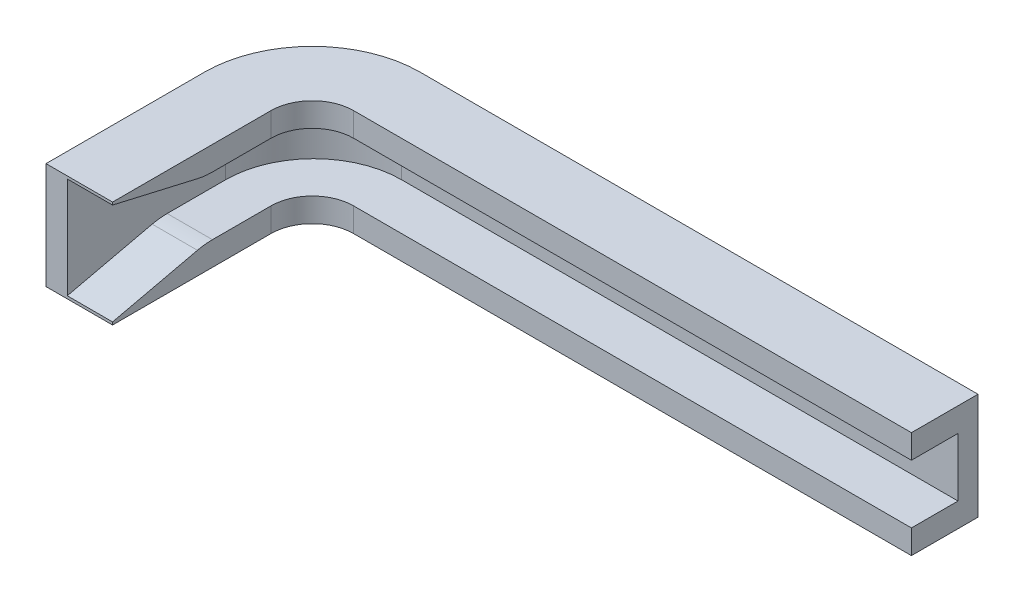
ISO-10303-21;
HEADER;
FILE_DESCRIPTION(('STEP AP214'),'2;1');
FILE_NAME('part.step','',(''),(''),'','','');
FILE_SCHEMA(('AUTOMOTIVE_DESIGN { 1 0 10303 214 1 1 1 1 }'));
ENDSEC;
DATA;
#1=APPLICATION_CONTEXT('core data for automotive mechanical design processes');
#2=APPLICATION_PROTOCOL_DEFINITION('international standard','automotive_design',2000,#1);
#3=PRODUCT_CONTEXT('',#1,'mechanical');
#4=PRODUCT('Part','Part','',(#3));
#5=PRODUCT_RELATED_PRODUCT_CATEGORY('part','',(#4));
#6=PRODUCT_DEFINITION_FORMATION('','',#4);
#7=PRODUCT_DEFINITION_CONTEXT('part definition',#1,'design');
#8=PRODUCT_DEFINITION('design','',#6,#7);
#9=PRODUCT_DEFINITION_SHAPE('','',#8);
#10=(LENGTH_UNIT() NAMED_UNIT(*) SI_UNIT(.MILLI.,.METRE.));
#11=(NAMED_UNIT(*) PLANE_ANGLE_UNIT() SI_UNIT($,.RADIAN.));
#12=(NAMED_UNIT(*) SI_UNIT($,.STERADIAN.) SOLID_ANGLE_UNIT());
#13=UNCERTAINTY_MEASURE_WITH_UNIT(LENGTH_MEASURE(1.E-05),#10,'distance_accuracy_value','');
#14=(GEOMETRIC_REPRESENTATION_CONTEXT(3) GLOBAL_UNCERTAINTY_ASSIGNED_CONTEXT((#13)) GLOBAL_UNIT_ASSIGNED_CONTEXT((#10,
#11,#12)) REPRESENTATION_CONTEXT('',''));
#15=CARTESIAN_POINT('',(0.,0.,0.));
#16=DIRECTION('',(0.,0.,1.));
#17=DIRECTION('',(1.,0.,0.));
#18=AXIS2_PLACEMENT_3D('',#15,#16,#17);
#19=CARTESIAN_POINT('',(0.,0.,20.));
#20=DIRECTION('',(1.,0.,0.));
#21=DIRECTION('',(0.,0.,-1.));
#22=AXIS2_PLACEMENT_3D('',#19,#20,#21);
#23=PLANE('',#22);
#24=DIRECTION('',(0.,0.,-1.));
#25=VECTOR('',#24,1.);
#26=CARTESIAN_POINT('',(0.,7.99999999999999,20.));
#27=LINE('',#26,#25);
#28=CARTESIAN_POINT('',(0.,7.99999999999999,20.));
#29=VERTEX_POINT('',#28);
#30=CARTESIAN_POINT('',(0.,7.99999999999999,8.1));
#31=VERTEX_POINT('',#30);
#32=EDGE_CURVE('E203',#29,#31,#27,.T.);
#33=ORIENTED_EDGE('',*,*,#32,.T.);
#34=DIRECTION('',(0.,-1.,0.));
#35=VECTOR('',#34,1.);
#36=CARTESIAN_POINT('',(0.,0.,8.1));
#37=LINE('',#36,#35);
#38=CARTESIAN_POINT('',(0.,0.,8.1));
#39=VERTEX_POINT('',#38);
#40=EDGE_CURVE('E219',#31,#39,#37,.T.);
#41=ORIENTED_EDGE('',*,*,#40,.T.);
#42=DIRECTION('',(0.,0.,-1.));
#43=VECTOR('',#42,1.);
#44=CARTESIAN_POINT('',(0.,0.,20.));
#45=LINE('',#44,#43);
#46=CARTESIAN_POINT('',(0.,0.,20.));
#47=VERTEX_POINT('',#46);
#48=EDGE_CURVE('E198',#47,#39,#45,.T.);
#49=ORIENTED_EDGE('',*,*,#48,.F.);
#50=DIRECTION('',(0.,-1.,0.));
#51=VECTOR('',#50,1.);
#52=CARTESIAN_POINT('',(0.,0.,20.));
#53=LINE('',#52,#51);
#54=EDGE_CURVE('E336',#29,#47,#53,.T.);
#55=ORIENTED_EDGE('',*,*,#54,.F.);
#56=EDGE_LOOP('',(#33,#41,#49,#55));
#57=FACE_BOUND('',#56,.T.);
#58=ADVANCED_FACE('F33',(#57),#23,.F.);
#59=CARTESIAN_POINT('',(0.,0.,20.));
#60=DIRECTION('',(0.,1.,0.));
#61=DIRECTION('',(0.,0.,1.));
#62=AXIS2_PLACEMENT_3D('',#59,#60,#61);
#63=PLANE('',#62);
#64=ORIENTED_EDGE('',*,*,#48,.T.);
#65=CARTESIAN_POINT('',(8.1,0.,8.1));
#66=DIRECTION('',(0.,1.,0.));
#67=DIRECTION('',(0.,0.,1.));
#68=AXIS2_PLACEMENT_3D('',#65,#66,#67);
#69=CIRCLE('',#68,8.1);
#70=CARTESIAN_POINT('',(8.1,0.,0.));
#71=VERTEX_POINT('',#70);
#72=EDGE_CURVE('E222',#39,#71,#69,.F.);
#73=ORIENTED_EDGE('',*,*,#72,.T.);
#74=DIRECTION('',(1.,0.,0.));
#75=VECTOR('',#74,1.);
#76=CARTESIAN_POINT('',(0.,0.,0.));
#77=LINE('',#76,#75);
#78=CARTESIAN_POINT('',(50.,0.,0.));
#79=VERTEX_POINT('',#78);
#80=EDGE_CURVE('E197',#71,#79,#77,.T.);
#81=ORIENTED_EDGE('',*,*,#80,.T.);
#82=DIRECTION('',(0.,0.,-1.));
#83=VECTOR('',#82,1.);
#84=CARTESIAN_POINT('',(50.,0.,20.));
#85=LINE('',#84,#83);
#86=CARTESIAN_POINT('',(50.,0.,5.00000000000001));
#87=VERTEX_POINT('',#86);
#88=EDGE_CURVE('E187',#87,#79,#85,.T.);
#89=ORIENTED_EDGE('',*,*,#88,.F.);
#90=DIRECTION('',(1.,0.,0.));
#91=VECTOR('',#90,1.);
#92=CARTESIAN_POINT('',(5.,0.,5.));
#93=LINE('',#92,#91);
#94=CARTESIAN_POINT('',(8.1,0.,5.));
#95=VERTEX_POINT('',#94);
#96=EDGE_CURVE('E170',#95,#87,#93,.T.);
#97=ORIENTED_EDGE('',*,*,#96,.F.);
#98=CARTESIAN_POINT('',(8.1,0.,8.1));
#99=DIRECTION('',(0.,1.,0.));
#100=DIRECTION('',(0.,0.,1.));
#101=AXIS2_PLACEMENT_3D('',#98,#99,#100);
#102=CIRCLE('',#101,3.1);
#103=CARTESIAN_POINT('',(5.,0.,8.1));
#104=VERTEX_POINT('',#103);
#105=EDGE_CURVE('E237',#95,#104,#102,.T.);
#106=ORIENTED_EDGE('',*,*,#105,.T.);
#107=DIRECTION('',(0.,0.,-1.));
#108=VECTOR('',#107,1.);
#109=CARTESIAN_POINT('',(5.,0.,20.));
#110=LINE('',#109,#108);
#111=CARTESIAN_POINT('',(5.,0.,20.));
#112=VERTEX_POINT('',#111);
#113=EDGE_CURVE('E180',#112,#104,#110,.T.);
#114=ORIENTED_EDGE('',*,*,#113,.F.);
#115=DIRECTION('',(1.,0.,0.));
#116=VECTOR('',#115,1.);
#117=CARTESIAN_POINT('',(0.,0.,20.));
#118=LINE('',#117,#116);
#119=EDGE_CURVE('E303',#47,#112,#118,.T.);
#120=ORIENTED_EDGE('',*,*,#119,.F.);
#121=EDGE_LOOP('',(#64,#73,#81,#89,#97,#106,#114,#120));
#122=FACE_BOUND('',#121,.T.);
#123=ADVANCED_FACE('F195',(#122),#63,.F.);
#124=CARTESIAN_POINT('',(50.,0.,20.));
#125=DIRECTION('',(-1.,0.,0.));
#126=DIRECTION('',(0.,0.,1.));
#127=AXIS2_PLACEMENT_3D('',#124,#125,#126);
#128=PLANE('',#127);
#129=DIRECTION('',(0.,0.,-1.));
#130=VECTOR('',#129,1.);
#131=CARTESIAN_POINT('',(50.,7.99999999999999,20.));
#132=LINE('',#131,#130);
#133=CARTESIAN_POINT('',(50.,7.99999999999999,5.00000000000001));
#134=VERTEX_POINT('',#133);
#135=CARTESIAN_POINT('',(50.,7.99999999999999,0.));
#136=VERTEX_POINT('',#135);
#137=EDGE_CURVE('E199',#134,#136,#132,.T.);
#138=ORIENTED_EDGE('',*,*,#137,.F.);
#139=DIRECTION('',(0.,-1.,0.));
#140=VECTOR('',#139,1.);
#141=CARTESIAN_POINT('',(50.,18.,5.00000000000001));
#142=LINE('',#141,#140);
#143=CARTESIAN_POINT('',(50.,6.20366363266101,5.00000000000001));
#144=VERTEX_POINT('',#143);
#145=EDGE_CURVE('E192',#134,#144,#142,.T.);
#146=ORIENTED_EDGE('',*,*,#145,.T.);
#147=DIRECTION('',(0.,0.,1.));
#148=VECTOR('',#147,1.);
#149=CARTESIAN_POINT('',(50.,6.20366363266101,1.5));
#150=LINE('',#149,#148);
#151=CARTESIAN_POINT('',(50.,6.20366363266101,1.5));
#152=VERTEX_POINT('',#151);
#153=EDGE_CURVE('E332',#152,#144,#150,.T.);
#154=ORIENTED_EDGE('',*,*,#153,.F.);
#155=DIRECTION('',(0.,1.,0.));
#156=VECTOR('',#155,1.);
#157=CARTESIAN_POINT('',(50.,6.20366363266101,1.5));
#158=LINE('',#157,#156);
#159=CARTESIAN_POINT('',(50.,1.803663632661,1.5));
#160=VERTEX_POINT('',#159);
#161=EDGE_CURVE('E325',#160,#152,#158,.T.);
#162=ORIENTED_EDGE('',*,*,#161,.F.);
#163=DIRECTION('',(0.,0.,1.));
#164=VECTOR('',#163,1.);
#165=CARTESIAN_POINT('',(50.,1.803663632661,1.5));
#166=LINE('',#165,#164);
#167=CARTESIAN_POINT('',(50.,1.803663632661,5.));
#168=VERTEX_POINT('',#167);
#169=EDGE_CURVE('E191',#160,#168,#166,.T.);
#170=ORIENTED_EDGE('',*,*,#169,.T.);
#171=EDGE_CURVE('E174',#168,#87,#142,.T.);
#172=ORIENTED_EDGE('',*,*,#171,.T.);
#173=ORIENTED_EDGE('',*,*,#88,.T.);
#174=DIRECTION('',(0.,1.,0.));
#175=VECTOR('',#174,1.);
#176=CARTESIAN_POINT('',(50.,0.,0.));
#177=LINE('',#176,#175);
#178=EDGE_CURVE('E343',#79,#136,#177,.T.);
#179=ORIENTED_EDGE('',*,*,#178,.T.);
#180=EDGE_LOOP('',(#138,#146,#154,#162,#170,#172,#173,#179));
#181=FACE_BOUND('',#180,.T.);
#182=ADVANCED_FACE('F185',(#181),#128,.F.);
#183=CARTESIAN_POINT('',(0.,7.99999999999999,20.));
#184=DIRECTION('',(0.,-1.,0.));
#185=DIRECTION('',(0.,0.,-1.));
#186=AXIS2_PLACEMENT_3D('',#183,#184,#185);
#187=PLANE('',#186);
#188=DIRECTION('',(-1.,0.,0.));
#189=VECTOR('',#188,1.);
#190=CARTESIAN_POINT('',(0.,7.99999999999999,0.));
#191=LINE('',#190,#189);
#192=CARTESIAN_POINT('',(8.1,7.99999999999999,0.));
#193=VERTEX_POINT('',#192);
#194=EDGE_CURVE('E338',#136,#193,#191,.T.);
#195=ORIENTED_EDGE('',*,*,#194,.T.);
#196=CARTESIAN_POINT('',(8.1,7.99999999999999,8.1));
#197=DIRECTION('',(0.,-1.,0.));
#198=DIRECTION('',(0.,0.,-1.));
#199=AXIS2_PLACEMENT_3D('',#196,#197,#198);
#200=CIRCLE('',#199,8.1);
#201=EDGE_CURVE('E226',#193,#31,#200,.F.);
#202=ORIENTED_EDGE('',*,*,#201,.T.);
#203=ORIENTED_EDGE('',*,*,#32,.F.);
#204=DIRECTION('',(-1.,0.,0.));
#205=VECTOR('',#204,1.);
#206=CARTESIAN_POINT('',(0.,7.99999999999999,20.));
#207=LINE('',#206,#205);
#208=CARTESIAN_POINT('',(5.,7.99999999999999,20.));
#209=VERTEX_POINT('',#208);
#210=EDGE_CURVE('E340',#209,#29,#207,.T.);
#211=ORIENTED_EDGE('',*,*,#210,.F.);
#212=DIRECTION('',(0.,0.,-1.));
#213=VECTOR('',#212,1.);
#214=CARTESIAN_POINT('',(5.,7.99999999999999,20.));
#215=LINE('',#214,#213);
#216=CARTESIAN_POINT('',(5.,7.99999999999999,8.1));
#217=VERTEX_POINT('',#216);
#218=EDGE_CURVE('E320',#209,#217,#215,.T.);
#219=ORIENTED_EDGE('',*,*,#218,.T.);
#220=CARTESIAN_POINT('',(8.1,7.99999999999999,8.1));
#221=DIRECTION('',(0.,-1.,0.));
#222=DIRECTION('',(0.,0.,-1.));
#223=AXIS2_PLACEMENT_3D('',#220,#221,#222);
#224=CIRCLE('',#223,3.1);
#225=CARTESIAN_POINT('',(8.1,7.99999999999999,5.));
#226=VERTEX_POINT('',#225);
#227=EDGE_CURVE('E243',#217,#226,#224,.T.);
#228=ORIENTED_EDGE('',*,*,#227,.T.);
#229=DIRECTION('',(1.,0.,0.));
#230=VECTOR('',#229,1.);
#231=CARTESIAN_POINT('',(0.,7.99999999999999,5.));
#232=LINE('',#231,#230);
#233=EDGE_CURVE('E315',#226,#134,#232,.T.);
#234=ORIENTED_EDGE('',*,*,#233,.T.);
#235=ORIENTED_EDGE('',*,*,#137,.T.);
#236=EDGE_LOOP('',(#195,#202,#203,#211,#219,#228,#234,#235));
#237=FACE_BOUND('',#236,.T.);
#238=ADVANCED_FACE('F363',(#237),#187,.F.);
#239=CARTESIAN_POINT('',(0.,0.,20.));
#240=DIRECTION('',(0.,0.,-1.));
#241=DIRECTION('',(-1.,0.,0.));
#242=AXIS2_PLACEMENT_3D('',#239,#240,#241);
#243=PLANE('',#242);
#244=DIRECTION('',(0.,-1.,0.));
#245=VECTOR('',#244,1.);
#246=CARTESIAN_POINT('',(5.,18.,20.));
#247=LINE('',#246,#245);
#248=CARTESIAN_POINT('',(5.,0.203663632661003,20.));
#249=VERTEX_POINT('',#248);
#250=EDGE_CURVE('E301',#249,#112,#247,.T.);
#251=ORIENTED_EDGE('',*,*,#250,.F.);
#252=DIRECTION('',(-1.,0.,0.));
#253=VECTOR('',#252,1.);
#254=CARTESIAN_POINT('',(0.,0.203663632661004,20.));
#255=LINE('',#254,#253);
#256=CARTESIAN_POINT('',(1.6,0.203663632661004,20.));
#257=VERTEX_POINT('',#256);
#258=EDGE_CURVE('E249',#249,#257,#255,.T.);
#259=ORIENTED_EDGE('',*,*,#258,.T.);
#260=DIRECTION('',(0.,-1.,0.));
#261=VECTOR('',#260,1.);
#262=CARTESIAN_POINT('',(1.6,6.20366363266101,20.));
#263=LINE('',#262,#261);
#264=CARTESIAN_POINT('',(1.6,7.80366363266101,20.));
#265=VERTEX_POINT('',#264);
#266=EDGE_CURVE('E298',#265,#257,#263,.T.);
#267=ORIENTED_EDGE('',*,*,#266,.F.);
#268=DIRECTION('',(1.,0.,0.));
#269=VECTOR('',#268,1.);
#270=CARTESIAN_POINT('',(0.,7.80366363266101,20.));
#271=LINE('',#270,#269);
#272=CARTESIAN_POINT('',(5.,7.80366363266101,20.));
#273=VERTEX_POINT('',#272);
#274=EDGE_CURVE('E247',#265,#273,#271,.T.);
#275=ORIENTED_EDGE('',*,*,#274,.T.);
#276=EDGE_CURVE('E306',#209,#273,#247,.T.);
#277=ORIENTED_EDGE('',*,*,#276,.F.);
#278=ORIENTED_EDGE('',*,*,#210,.T.);
#279=ORIENTED_EDGE('',*,*,#54,.T.);
#280=ORIENTED_EDGE('',*,*,#119,.T.);
#281=EDGE_LOOP('',(#251,#259,#267,#275,#277,#278,#279,#280));
#282=FACE_BOUND('',#281,.T.);
#283=ADVANCED_FACE('F297',(#282),#243,.F.);
#284=CARTESIAN_POINT('',(0.,0.,0.));
#285=DIRECTION('',(0.,0.,-1.));
#286=DIRECTION('',(-1.,0.,0.));
#287=AXIS2_PLACEMENT_3D('',#284,#285,#286);
#288=PLANE('',#287);
#289=ORIENTED_EDGE('',*,*,#80,.F.);
#290=DIRECTION('',(0.,-1.,0.));
#291=VECTOR('',#290,1.);
#292=CARTESIAN_POINT('',(8.1,7.99999999999999,0.));
#293=LINE('',#292,#291);
#294=EDGE_CURVE('E224',#71,#193,#293,.F.);
#295=ORIENTED_EDGE('',*,*,#294,.T.);
#296=ORIENTED_EDGE('',*,*,#194,.F.);
#297=ORIENTED_EDGE('',*,*,#178,.F.);
#298=EDGE_LOOP('',(#289,#295,#296,#297));
#299=FACE_BOUND('',#298,.T.);
#300=ADVANCED_FACE('F359',(#299),#288,.T.);
#301=CARTESIAN_POINT('',(1.6,6.20366363266101,1.5));
#302=DIRECTION('',(-1.,0.,0.));
#303=DIRECTION('',(0.,-1.,0.));
#304=AXIS2_PLACEMENT_3D('',#301,#302,#303);
#305=PLANE('',#304);
#306=DIRECTION('',(0.,0.,1.));
#307=VECTOR('',#306,1.);
#308=CARTESIAN_POINT('',(1.6,1.803663632661,1.5));
#309=LINE('',#308,#307);
#310=CARTESIAN_POINT('',(1.6,1.803663632661,8.1));
#311=VERTEX_POINT('',#310);
#312=CARTESIAN_POINT('',(1.6,1.803663632661,12.4999605596372));
#313=VERTEX_POINT('',#312);
#314=EDGE_CURVE('E275',#311,#313,#309,.T.);
#315=ORIENTED_EDGE('',*,*,#314,.F.);
#316=DIRECTION('',(0.,-1.,0.));
#317=VECTOR('',#316,1.);
#318=CARTESIAN_POINT('',(1.6,6.20366363266101,8.1));
#319=LINE('',#318,#317);
#320=CARTESIAN_POINT('',(1.6,6.20366363266101,8.1));
#321=VERTEX_POINT('',#320);
#322=EDGE_CURVE('E215',#311,#321,#319,.F.);
#323=ORIENTED_EDGE('',*,*,#322,.T.);
#324=DIRECTION('',(0.,0.,1.));
#325=VECTOR('',#324,1.);
#326=CARTESIAN_POINT('',(1.6,6.20366363266101,1.5));
#327=LINE('',#326,#325);
#328=CARTESIAN_POINT('',(1.6,6.20366363266101,12.4999605596372));
#329=VERTEX_POINT('',#328);
#330=EDGE_CURVE('E330',#321,#329,#327,.T.);
#331=ORIENTED_EDGE('',*,*,#330,.T.);
#332=CARTESIAN_POINT('',(1.6,11.203663632661,12.4999605596372));
#333=DIRECTION('',(-1.,0.,0.));
#334=DIRECTION('',(0.,-1.,0.));
#335=AXIS2_PLACEMENT_3D('',#332,#333,#334);
#336=CIRCLE('',#335,5.);
#337=CARTESIAN_POINT('',(1.6,6.33181330873483,13.6247158313565));
#338=VERTEX_POINT('',#337);
#339=EDGE_CURVE('E11',#329,#338,#336,.T.);
#340=ORIENTED_EDGE('',*,*,#339,.T.);
#341=DIRECTION('',(0.,-0.224951054343867,-0.974370064785235));
#342=VECTOR('',#341,1.);
#343=CARTESIAN_POINT('',(1.6,3.66776576190135,2.08545815430146));
#344=LINE('',#343,#342);
#345=EDGE_CURVE('E257',#338,#265,#344,.F.);
#346=ORIENTED_EDGE('',*,*,#345,.T.);
#347=ORIENTED_EDGE('',*,*,#266,.T.);
#348=DIRECTION('',(0.,-0.224951054343867,0.974370064785235));
#349=VECTOR('',#348,1.);
#350=CARTESIAN_POINT('',(1.6,4.56221460156251,1.12104163136548));
#351=LINE('',#350,#349);
#352=CARTESIAN_POINT('',(1.6,1.67551395658718,13.6247158313565));
#353=VERTEX_POINT('',#352);
#354=EDGE_CURVE('E254',#257,#353,#351,.F.);
#355=ORIENTED_EDGE('',*,*,#354,.T.);
#356=CARTESIAN_POINT('',(1.6,-3.196336367339,12.4999605596372));
#357=DIRECTION('',(-1.,0.,0.));
#358=DIRECTION('',(0.,-1.,0.));
#359=AXIS2_PLACEMENT_3D('',#356,#357,#358);
#360=CIRCLE('',#359,5.);
#361=EDGE_CURVE('E41',#353,#313,#360,.T.);
#362=ORIENTED_EDGE('',*,*,#361,.T.);
#363=EDGE_LOOP('',(#315,#323,#331,#340,#346,#347,#355,#362));
#364=FACE_BOUND('',#363,.T.);
#365=ADVANCED_FACE('F274',(#364),#305,.F.);
#366=CARTESIAN_POINT('',(1.6,6.20366363266101,1.5));
#367=DIRECTION('',(0.,1.,0.));
#368=DIRECTION('',(0.,0.,1.));
#369=AXIS2_PLACEMENT_3D('',#366,#367,#368);
#370=PLANE('',#369);
#371=DIRECTION('',(0.,0.,1.));
#372=VECTOR('',#371,1.);
#373=CARTESIAN_POINT('',(5.,6.20366363266101,1.5));
#374=LINE('',#373,#372);
#375=CARTESIAN_POINT('',(5.,6.20366363266101,8.1));
#376=VERTEX_POINT('',#375);
#377=CARTESIAN_POINT('',(5.,6.20366363266101,12.4999605596372));
#378=VERTEX_POINT('',#377);
#379=EDGE_CURVE('E317',#376,#378,#374,.T.);
#380=ORIENTED_EDGE('',*,*,#379,.T.);
#381=DIRECTION('',(1.,0.,0.));
#382=VECTOR('',#381,1.);
#383=CARTESIAN_POINT('',(1.6,6.20366363266101,12.4999605596372));
#384=LINE('',#383,#382);
#385=EDGE_CURVE('E266',#378,#329,#384,.F.);
#386=ORIENTED_EDGE('',*,*,#385,.T.);
#387=ORIENTED_EDGE('',*,*,#330,.F.);
#388=CARTESIAN_POINT('',(8.2,6.20366363266101,8.1));
#389=DIRECTION('',(0.,1.,0.));
#390=DIRECTION('',(0.,0.,1.));
#391=AXIS2_PLACEMENT_3D('',#388,#389,#390);
#392=CIRCLE('',#391,6.6);
#393=CARTESIAN_POINT('',(8.2,6.20366363266101,1.5));
#394=VERTEX_POINT('',#393);
#395=EDGE_CURVE('E217',#321,#394,#392,.F.);
#396=ORIENTED_EDGE('',*,*,#395,.T.);
#397=DIRECTION('',(-1.,0.,0.));
#398=VECTOR('',#397,1.);
#399=CARTESIAN_POINT('',(1.6,6.20366363266101,1.5));
#400=LINE('',#399,#398);
#401=EDGE_CURVE('E285',#152,#394,#400,.T.);
#402=ORIENTED_EDGE('',*,*,#401,.F.);
#403=ORIENTED_EDGE('',*,*,#153,.T.);
#404=DIRECTION('',(-1.,0.,0.));
#405=VECTOR('',#404,1.);
#406=CARTESIAN_POINT('',(1.6,6.20366363266101,5.));
#407=LINE('',#406,#405);
#408=CARTESIAN_POINT('',(8.1,6.20366363266101,5.));
#409=VERTEX_POINT('',#408);
#410=EDGE_CURVE('E309',#144,#409,#407,.T.);
#411=ORIENTED_EDGE('',*,*,#410,.T.);
#412=CARTESIAN_POINT('',(8.1,6.20366363266101,8.1));
#413=DIRECTION('',(0.,1.,0.));
#414=DIRECTION('',(0.,0.,1.));
#415=AXIS2_PLACEMENT_3D('',#412,#413,#414);
#416=CIRCLE('',#415,3.1);
#417=EDGE_CURVE('E241',#409,#376,#416,.T.);
#418=ORIENTED_EDGE('',*,*,#417,.T.);
#419=EDGE_LOOP('',(#380,#386,#387,#396,#402,#403,#411,#418));
#420=FACE_BOUND('',#419,.T.);
#421=ADVANCED_FACE('F370',(#420),#370,.F.);
#422=CARTESIAN_POINT('',(1.6,1.803663632661,1.5));
#423=DIRECTION('',(0.,-1.,0.));
#424=DIRECTION('',(0.,0.,-1.));
#425=AXIS2_PLACEMENT_3D('',#422,#423,#424);
#426=PLANE('',#425);
#427=ORIENTED_EDGE('',*,*,#314,.T.);
#428=DIRECTION('',(-1.,0.,0.));
#429=VECTOR('',#428,1.);
#430=CARTESIAN_POINT('',(5.,1.803663632661,12.4999605596372));
#431=LINE('',#430,#429);
#432=CARTESIAN_POINT('',(5.,1.803663632661,12.4999605596372));
#433=VERTEX_POINT('',#432);
#434=EDGE_CURVE('E259',#313,#433,#431,.F.);
#435=ORIENTED_EDGE('',*,*,#434,.T.);
#436=DIRECTION('',(0.,0.,-1.));
#437=VECTOR('',#436,1.);
#438=CARTESIAN_POINT('',(5.,1.803663632661,1.5));
#439=LINE('',#438,#437);
#440=CARTESIAN_POINT('',(5.,1.803663632661,8.1));
#441=VERTEX_POINT('',#440);
#442=EDGE_CURVE('E208',#433,#441,#439,.T.);
#443=ORIENTED_EDGE('',*,*,#442,.T.);
#444=CARTESIAN_POINT('',(8.1,1.803663632661,8.1));
#445=DIRECTION('',(0.,-1.,0.));
#446=DIRECTION('',(0.,0.,-1.));
#447=AXIS2_PLACEMENT_3D('',#444,#445,#446);
#448=CIRCLE('',#447,3.1);
#449=CARTESIAN_POINT('',(8.1,1.803663632661,5.));
#450=VERTEX_POINT('',#449);
#451=EDGE_CURVE('E239',#441,#450,#448,.T.);
#452=ORIENTED_EDGE('',*,*,#451,.T.);
#453=DIRECTION('',(1.,0.,0.));
#454=VECTOR('',#453,1.);
#455=CARTESIAN_POINT('',(1.6,1.803663632661,5.));
#456=LINE('',#455,#454);
#457=EDGE_CURVE('E201',#450,#168,#456,.T.);
#458=ORIENTED_EDGE('',*,*,#457,.T.);
#459=ORIENTED_EDGE('',*,*,#169,.F.);
#460=DIRECTION('',(1.,0.,0.));
#461=VECTOR('',#460,1.);
#462=CARTESIAN_POINT('',(1.6,1.803663632661,1.5));
#463=LINE('',#462,#461);
#464=CARTESIAN_POINT('',(8.2,1.803663632661,1.5));
#465=VERTEX_POINT('',#464);
#466=EDGE_CURVE('E323',#465,#160,#463,.T.);
#467=ORIENTED_EDGE('',*,*,#466,.F.);
#468=CARTESIAN_POINT('',(8.2,1.803663632661,8.1));
#469=DIRECTION('',(0.,-1.,0.));
#470=DIRECTION('',(0.,0.,-1.));
#471=AXIS2_PLACEMENT_3D('',#468,#469,#470);
#472=CIRCLE('',#471,6.6);
#473=EDGE_CURVE('E213',#465,#311,#472,.F.);
#474=ORIENTED_EDGE('',*,*,#473,.T.);
#475=EDGE_LOOP('',(#427,#435,#443,#452,#458,#459,#467,#474));
#476=FACE_BOUND('',#475,.T.);
#477=ADVANCED_FACE('F282',(#476),#426,.F.);
#478=CARTESIAN_POINT('',(0.,0.,1.5));
#479=DIRECTION('',(0.,0.,1.));
#480=DIRECTION('',(1.,0.,0.));
#481=AXIS2_PLACEMENT_3D('',#478,#479,#480);
#482=PLANE('',#481);
#483=ORIENTED_EDGE('',*,*,#401,.T.);
#484=DIRECTION('',(0.,-1.,0.));
#485=VECTOR('',#484,1.);
#486=CARTESIAN_POINT('',(8.2,0.,1.5));
#487=LINE('',#486,#485);
#488=EDGE_CURVE('E210',#394,#465,#487,.T.);
#489=ORIENTED_EDGE('',*,*,#488,.T.);
#490=ORIENTED_EDGE('',*,*,#466,.T.);
#491=ORIENTED_EDGE('',*,*,#161,.T.);
#492=EDGE_LOOP('',(#483,#489,#490,#491));
#493=FACE_BOUND('',#492,.T.);
#494=ADVANCED_FACE('F374',(#493),#482,.T.);
#495=CARTESIAN_POINT('',(5.,18.,5.));
#496=DIRECTION('',(0.,0.,-1.));
#497=DIRECTION('',(-1.,0.,0.));
#498=AXIS2_PLACEMENT_3D('',#495,#496,#497);
#499=PLANE('',#498);
#500=ORIENTED_EDGE('',*,*,#457,.F.);
#501=DIRECTION('',(0.,-1.,0.));
#502=VECTOR('',#501,1.);
#503=CARTESIAN_POINT('',(8.1,0.,5.));
#504=LINE('',#503,#502);
#505=EDGE_CURVE('E177',#450,#95,#504,.T.);
#506=ORIENTED_EDGE('',*,*,#505,.T.);
#507=ORIENTED_EDGE('',*,*,#96,.T.);
#508=ORIENTED_EDGE('',*,*,#171,.F.);
#509=EDGE_LOOP('',(#500,#506,#507,#508));
#510=FACE_BOUND('',#509,.T.);
#511=ADVANCED_FACE('F173',(#510),#499,.F.);
#512=CARTESIAN_POINT('',(5.,18.,20.));
#513=DIRECTION('',(-1.,0.,0.));
#514=DIRECTION('',(0.,0.,1.));
#515=AXIS2_PLACEMENT_3D('',#512,#513,#514);
#516=PLANE('',#515);
#517=ORIENTED_EDGE('',*,*,#442,.F.);
#518=CARTESIAN_POINT('',(5.,-3.196336367339,12.4999605596372));
#519=DIRECTION('',(-1.,0.,0.));
#520=DIRECTION('',(0.,0.,1.));
#521=AXIS2_PLACEMENT_3D('',#518,#519,#520);
#522=CIRCLE('',#521,5.);
#523=CARTESIAN_POINT('',(5.,1.67551395658718,13.6247158313565));
#524=VERTEX_POINT('',#523);
#525=EDGE_CURVE('E262',#433,#524,#522,.F.);
#526=ORIENTED_EDGE('',*,*,#525,.T.);
#527=DIRECTION('',(0.,0.224951054343867,-0.974370064785235));
#528=VECTOR('',#527,1.);
#529=CARTESIAN_POINT('',(5.,1.803663632661,13.0696386011454));
#530=LINE('',#529,#528);
#531=EDGE_CURVE('E245',#524,#249,#530,.F.);
#532=ORIENTED_EDGE('',*,*,#531,.T.);
#533=ORIENTED_EDGE('',*,*,#250,.T.);
#534=ORIENTED_EDGE('',*,*,#113,.T.);
#535=DIRECTION('',(0.,-1.,0.));
#536=VECTOR('',#535,1.);
#537=CARTESIAN_POINT('',(5.,1.803663632661,8.1));
#538=LINE('',#537,#536);
#539=EDGE_CURVE('E229',#104,#441,#538,.F.);
#540=ORIENTED_EDGE('',*,*,#539,.T.);
#541=EDGE_LOOP('',(#517,#526,#532,#533,#534,#540));
#542=FACE_BOUND('',#541,.T.);
#543=ADVANCED_FACE('F290',(#542),#516,.F.);
#544=DIRECTION('',(0.,0.224951054343867,0.974370064785235));
#545=VECTOR('',#544,1.);
#546=CARTESIAN_POINT('',(5.,6.20366363266101,13.0696386011454));
#547=LINE('',#546,#545);
#548=CARTESIAN_POINT('',(5.,6.33181330873483,13.6247158313565));
#549=VERTEX_POINT('',#548);
#550=EDGE_CURVE('E252',#273,#549,#547,.F.);
#551=ORIENTED_EDGE('',*,*,#550,.T.);
#552=CARTESIAN_POINT('',(5.,11.203663632661,12.4999605596372));
#553=DIRECTION('',(-1.,0.,0.));
#554=DIRECTION('',(0.,0.,1.));
#555=AXIS2_PLACEMENT_3D('',#552,#553,#554);
#556=CIRCLE('',#555,5.);
#557=EDGE_CURVE('E270',#549,#378,#556,.F.);
#558=ORIENTED_EDGE('',*,*,#557,.T.);
#559=ORIENTED_EDGE('',*,*,#379,.F.);
#560=DIRECTION('',(0.,-1.,0.));
#561=VECTOR('',#560,1.);
#562=CARTESIAN_POINT('',(5.,7.99999999999999,8.1));
#563=LINE('',#562,#561);
#564=EDGE_CURVE('E235',#376,#217,#563,.F.);
#565=ORIENTED_EDGE('',*,*,#564,.T.);
#566=ORIENTED_EDGE('',*,*,#218,.F.);
#567=ORIENTED_EDGE('',*,*,#276,.T.);
#568=EDGE_LOOP('',(#551,#558,#559,#565,#566,#567));
#569=FACE_BOUND('',#568,.T.);
#570=ADVANCED_FACE('F385',(#569),#516,.F.);
#571=ORIENTED_EDGE('',*,*,#233,.F.);
#572=DIRECTION('',(0.,-1.,0.));
#573=VECTOR('',#572,1.);
#574=CARTESIAN_POINT('',(8.1,6.20366363266101,5.));
#575=LINE('',#574,#573);
#576=EDGE_CURVE('E232',#226,#409,#575,.T.);
#577=ORIENTED_EDGE('',*,*,#576,.T.);
#578=ORIENTED_EDGE('',*,*,#410,.F.);
#579=ORIENTED_EDGE('',*,*,#145,.F.);
#580=EDGE_LOOP('',(#571,#577,#578,#579));
#581=FACE_BOUND('',#580,.T.);
#582=ADVANCED_FACE('F368',(#581),#499,.F.);
#583=CARTESIAN_POINT('',(8.2,0.,8.1));
#584=DIRECTION('',(0.,-1.,0.));
#585=DIRECTION('',(1.,0.,0.));
#586=AXIS2_PLACEMENT_3D('',#583,#584,#585);
#587=CYLINDRICAL_SURFACE('',#586,6.6);
#588=ORIENTED_EDGE('',*,*,#395,.F.);
#589=ORIENTED_EDGE('',*,*,#322,.F.);
#590=ORIENTED_EDGE('',*,*,#473,.F.);
#591=ORIENTED_EDGE('',*,*,#488,.F.);
#592=EDGE_LOOP('',(#588,#589,#590,#591));
#593=FACE_BOUND('',#592,.T.);
#594=ADVANCED_FACE('F403',(#593),#587,.F.);
#595=CARTESIAN_POINT('',(8.1,0.,8.1));
#596=DIRECTION('',(0.,1.,0.));
#597=DIRECTION('',(0.,0.,1.));
#598=AXIS2_PLACEMENT_3D('',#595,#596,#597);
#599=CYLINDRICAL_SURFACE('',#598,8.1);
#600=ORIENTED_EDGE('',*,*,#201,.F.);
#601=ORIENTED_EDGE('',*,*,#294,.F.);
#602=ORIENTED_EDGE('',*,*,#72,.F.);
#603=ORIENTED_EDGE('',*,*,#40,.F.);
#604=EDGE_LOOP('',(#600,#601,#602,#603));
#605=FACE_BOUND('',#604,.T.);
#606=ADVANCED_FACE('F356',(#605),#599,.T.);
#607=CARTESIAN_POINT('',(8.1,18.,8.1));
#608=DIRECTION('',(0.,1.,0.));
#609=DIRECTION('',(0.,0.,1.));
#610=AXIS2_PLACEMENT_3D('',#607,#608,#609);
#611=CYLINDRICAL_SURFACE('',#610,3.1);
#612=ORIENTED_EDGE('',*,*,#451,.F.);
#613=ORIENTED_EDGE('',*,*,#539,.F.);
#614=ORIENTED_EDGE('',*,*,#105,.F.);
#615=ORIENTED_EDGE('',*,*,#505,.F.);
#616=EDGE_LOOP('',(#612,#613,#614,#615));
#617=FACE_BOUND('',#616,.T.);
#618=ADVANCED_FACE('F378',(#617),#611,.F.);
#619=CARTESIAN_POINT('',(8.1,18.,8.1));
#620=DIRECTION('',(0.,1.,0.));
#621=DIRECTION('',(0.,0.,1.));
#622=AXIS2_PLACEMENT_3D('',#619,#620,#621);
#623=CYLINDRICAL_SURFACE('',#622,3.1);
#624=ORIENTED_EDGE('',*,*,#227,.F.);
#625=ORIENTED_EDGE('',*,*,#564,.F.);
#626=ORIENTED_EDGE('',*,*,#417,.F.);
#627=ORIENTED_EDGE('',*,*,#576,.F.);
#628=EDGE_LOOP('',(#624,#625,#626,#627));
#629=FACE_BOUND('',#628,.T.);
#630=ADVANCED_FACE('F384',(#629),#623,.F.);
#631=CARTESIAN_POINT('',(1.6,1.803663632661,13.0696386011454));
#632=DIRECTION('',(0.,-0.974370064785235,-0.224951054343867));
#633=DIRECTION('',(1.,0.,0.));
#634=AXIS2_PLACEMENT_3D('',#631,#632,#633);
#635=PLANE('',#634);
#636=ORIENTED_EDGE('',*,*,#531,.F.);
#637=DIRECTION('',(1.,0.,0.));
#638=VECTOR('',#637,1.);
#639=CARTESIAN_POINT('',(1.6,1.67551395658718,13.6247158313565));
#640=LINE('',#639,#638);
#641=EDGE_CURVE('E264',#524,#353,#640,.F.);
#642=ORIENTED_EDGE('',*,*,#641,.T.);
#643=ORIENTED_EDGE('',*,*,#354,.F.);
#644=ORIENTED_EDGE('',*,*,#258,.F.);
#645=EDGE_LOOP('',(#636,#642,#643,#644));
#646=FACE_BOUND('',#645,.T.);
#647=ADVANCED_FACE('F294',(#646),#635,.F.);
#648=CARTESIAN_POINT('',(1.6,6.20366363266101,13.0696386011454));
#649=DIRECTION('',(0.,0.974370064785235,-0.224951054343867));
#650=DIRECTION('',(-1.,0.,0.));
#651=AXIS2_PLACEMENT_3D('',#648,#649,#650);
#652=PLANE('',#651);
#653=ORIENTED_EDGE('',*,*,#345,.F.);
#654=DIRECTION('',(-1.,0.,0.));
#655=VECTOR('',#654,1.);
#656=CARTESIAN_POINT('',(5.,6.33181330873483,13.6247158313565));
#657=LINE('',#656,#655);
#658=EDGE_CURVE('E53',#338,#549,#657,.F.);
#659=ORIENTED_EDGE('',*,*,#658,.T.);
#660=ORIENTED_EDGE('',*,*,#550,.F.);
#661=ORIENTED_EDGE('',*,*,#274,.F.);
#662=EDGE_LOOP('',(#653,#659,#660,#661));
#663=FACE_BOUND('',#662,.T.);
#664=ADVANCED_FACE('F394',(#663),#652,.F.);
#665=CARTESIAN_POINT('',(1.6,-3.196336367339,12.4999605596372));
#666=DIRECTION('',(1.,0.,0.));
#667=DIRECTION('',(0.,0.,-1.));
#668=AXIS2_PLACEMENT_3D('',#665,#666,#667);
#669=CYLINDRICAL_SURFACE('',#668,5.);
#670=ORIENTED_EDGE('',*,*,#361,.F.);
#671=ORIENTED_EDGE('',*,*,#641,.F.);
#672=ORIENTED_EDGE('',*,*,#525,.F.);
#673=ORIENTED_EDGE('',*,*,#434,.F.);
#674=EDGE_LOOP('',(#670,#671,#672,#673));
#675=FACE_BOUND('',#674,.T.);
#676=ADVANCED_FACE('F287',(#675),#669,.T.);
#677=CARTESIAN_POINT('',(1.6,11.203663632661,12.4999605596372));
#678=DIRECTION('',(-1.,0.,0.));
#679=DIRECTION('',(0.,0.,1.));
#680=AXIS2_PLACEMENT_3D('',#677,#678,#679);
#681=CYLINDRICAL_SURFACE('',#680,5.);
#682=ORIENTED_EDGE('',*,*,#557,.F.);
#683=ORIENTED_EDGE('',*,*,#658,.F.);
#684=ORIENTED_EDGE('',*,*,#339,.F.);
#685=ORIENTED_EDGE('',*,*,#385,.F.);
#686=EDGE_LOOP('',(#682,#683,#684,#685));
#687=FACE_BOUND('',#686,.T.);
#688=ADVANCED_FACE('F35',(#687),#681,.T.);
#689=CLOSED_SHELL('',(#58,#123,#182,#238,#283,#300,#365,#421,#477,#494,#511,#543,#570,#582,#594,
#606,#618,#630,#647,#664,#676,#688));
#690=MANIFOLD_SOLID_BREP('B2',#689);
#691=ADVANCED_BREP_SHAPE_REPRESENTATION('',(#18,#690),#14);
#692=SHAPE_DEFINITION_REPRESENTATION(#9,#691);
ENDSEC;
END-ISO-10303-21;
